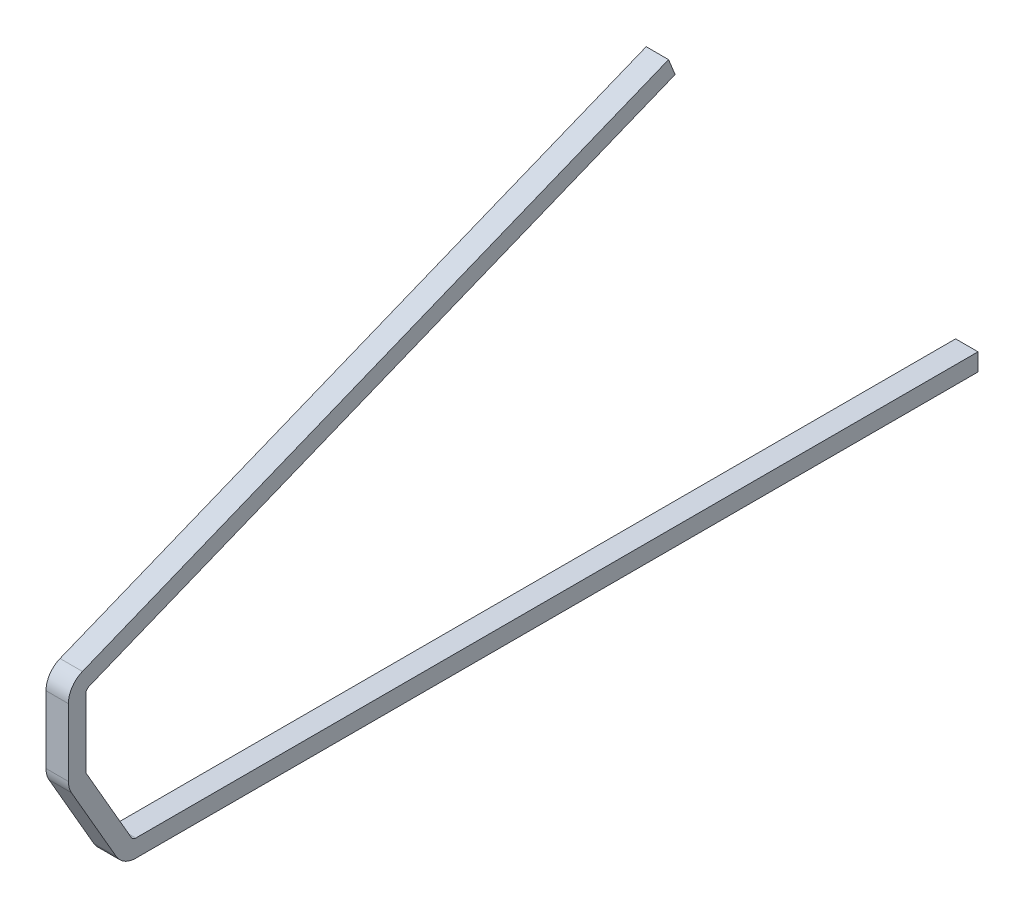
ISO-10303-21;
HEADER;
FILE_DESCRIPTION(('STEP AP214'),'2;1');
FILE_NAME('part.step','',(''),(''),'','','');
FILE_SCHEMA(('AUTOMOTIVE_DESIGN { 1 0 10303 214 1 1 1 1 }'));
ENDSEC;
DATA;
#1=APPLICATION_CONTEXT('core data for automotive mechanical design processes');
#2=APPLICATION_PROTOCOL_DEFINITION('international standard','automotive_design',2000,#1);
#3=PRODUCT_CONTEXT('',#1,'mechanical');
#4=PRODUCT('Part','Part','',(#3));
#5=PRODUCT_RELATED_PRODUCT_CATEGORY('part','',(#4));
#6=PRODUCT_DEFINITION_FORMATION('','',#4);
#7=PRODUCT_DEFINITION_CONTEXT('part definition',#1,'design');
#8=PRODUCT_DEFINITION('design','',#6,#7);
#9=PRODUCT_DEFINITION_SHAPE('','',#8);
#10=(LENGTH_UNIT() NAMED_UNIT(*) SI_UNIT(.MILLI.,.METRE.));
#11=(NAMED_UNIT(*) PLANE_ANGLE_UNIT() SI_UNIT($,.RADIAN.));
#12=(NAMED_UNIT(*) SI_UNIT($,.STERADIAN.) SOLID_ANGLE_UNIT());
#13=UNCERTAINTY_MEASURE_WITH_UNIT(LENGTH_MEASURE(1.E-05),#10,'distance_accuracy_value','');
#14=(GEOMETRIC_REPRESENTATION_CONTEXT(3) GLOBAL_UNCERTAINTY_ASSIGNED_CONTEXT((#13)) GLOBAL_UNIT_ASSIGNED_CONTEXT((#10,
#11,#12)) REPRESENTATION_CONTEXT('',''));
#15=CARTESIAN_POINT('',(0.,0.,0.));
#16=DIRECTION('',(0.,0.,1.));
#17=DIRECTION('',(1.,0.,0.));
#18=AXIS2_PLACEMENT_3D('',#15,#16,#17);
#19=CARTESIAN_POINT('',(0.,3.35260506818303,9.32259618943231));
#20=DIRECTION('',(-1.,0.,0.));
#21=DIRECTION('',(0.,0.,1.));
#22=AXIS2_PLACEMENT_3D('',#19,#20,#21);
#23=CYLINDRICAL_SURFACE('',#22,0.450000000000004);
#24=DIRECTION('',(1.,0.,0.));
#25=VECTOR('',#24,1.);
#26=CARTESIAN_POINT('',(0.,3.76983780273808,9.49116915646947));
#27=LINE('',#26,#25);
#28=CARTESIAN_POINT('',(-0.223999999999998,3.76983780273808,9.49116915646947));
#29=VERTEX_POINT('',#28);
#30=CARTESIAN_POINT('',(0.224,3.76983780273808,9.49116915646947));
#31=VERTEX_POINT('',#30);
#32=EDGE_CURVE('E36',#29,#31,#27,.T.);
#33=ORIENTED_EDGE('',*,*,#32,.F.);
#34=CARTESIAN_POINT('',(-0.223999999999998,3.35260506818303,9.32259618943231));
#35=DIRECTION('',(-1.,0.,0.));
#36=DIRECTION('',(0.,0.,1.));
#37=AXIS2_PLACEMENT_3D('',#34,#35,#36);
#38=CIRCLE('',#37,0.450000000000002);
#39=CARTESIAN_POINT('',(-0.223999999999998,3.35260506818303,9.77259618943231));
#40=VERTEX_POINT('',#39);
#41=EDGE_CURVE('E241',#40,#29,#38,.T.);
#42=ORIENTED_EDGE('',*,*,#41,.F.);
#43=DIRECTION('',(1.,0.,0.));
#44=VECTOR('',#43,1.);
#45=CARTESIAN_POINT('',(-0.223999999999998,3.35260506818303,9.77259618943231));
#46=LINE('',#45,#44);
#47=CARTESIAN_POINT('',(0.224,3.35260506818303,9.77259618943231));
#48=VERTEX_POINT('',#47);
#49=EDGE_CURVE('E11',#40,#48,#46,.T.);
#50=ORIENTED_EDGE('',*,*,#49,.T.);
#51=CARTESIAN_POINT('',(0.224,3.35260506818303,9.32259618943231));
#52=DIRECTION('',(1.,0.,0.));
#53=DIRECTION('',(0.,0.927183854566787,0.374606593415914));
#54=AXIS2_PLACEMENT_3D('',#51,#52,#53);
#55=CIRCLE('',#54,0.45);
#56=EDGE_CURVE('E234',#31,#48,#55,.T.);
#57=ORIENTED_EDGE('',*,*,#56,.F.);
#58=EDGE_LOOP('',(#33,#42,#50,#57));
#59=FACE_BOUND('',#58,.T.);
#60=ADVANCED_FACE('F17',(#59),#23,.T.);
#61=CARTESIAN_POINT('',(0.224,3.4453234536397,9.3600568487739));
#62=DIRECTION('',(1.,0.,0.));
#63=DIRECTION('',(0.,-0.927183854566786,-0.374606593415915));
#64=AXIS2_PLACEMENT_3D('',#61,#62,#63);
#65=PLANE('',#64);
#66=DIRECTION('',(0.,-0.374606593415914,0.927183854566787));
#67=VECTOR('',#66,1.);
#68=CARTESIAN_POINT('',(0.224,3.4709150269852,10.2310289889221));
#69=LINE('',#68,#67);
#70=CARTESIAN_POINT('',(0.224000000000003,8.50728928549821,-2.23443472720757));
#71=VERTEX_POINT('',#70);
#72=EDGE_CURVE('E249',#71,#31,#69,.T.);
#73=ORIENTED_EDGE('',*,*,#72,.T.);
#74=ORIENTED_EDGE('',*,*,#56,.T.);
#75=DIRECTION('',(0.,-1.,0.));
#76=VECTOR('',#75,1.);
#77=CARTESIAN_POINT('',(0.224,1.20671767076522,9.77259618943231));
#78=LINE('',#77,#76);
#79=CARTESIAN_POINT('',(0.224,2.00468220477703,9.77259618943231));
#80=VERTEX_POINT('',#79);
#81=EDGE_CURVE('E211',#48,#80,#78,.T.);
#82=ORIENTED_EDGE('',*,*,#81,.T.);
#83=CARTESIAN_POINT('',(0.224,2.00468220477703,9.32259618943231));
#84=DIRECTION('',(1.,0.,0.));
#85=DIRECTION('',(0.,0.,1.));
#86=AXIS2_PLACEMENT_3D('',#83,#84,#85);
#87=CIRCLE('',#86,0.449999999999997);
#88=CARTESIAN_POINT('',(0.224,1.77968220477703,9.71230762113531));
#89=VERTEX_POINT('',#88);
#90=EDGE_CURVE('E197',#80,#89,#87,.T.);
#91=ORIENTED_EDGE('',*,*,#90,.T.);
#92=DIRECTION('',(0.,-0.866025403784442,-0.499999999999995));
#93=VECTOR('',#92,1.);
#94=CARTESIAN_POINT('',(0.224,-0.46605755777324,8.41572916469708));
#95=LINE('',#94,#93);
#96=CARTESIAN_POINT('',(0.224,0.225000000000002,8.81471143170298));
#97=VERTEX_POINT('',#96);
#98=EDGE_CURVE('E182',#89,#97,#95,.T.);
#99=ORIENTED_EDGE('',*,*,#98,.T.);
#100=CARTESIAN_POINT('',(0.224,0.45,8.42499999999998));
#101=DIRECTION('',(1.,0.,0.));
#102=DIRECTION('',(0.,-0.499999999999995,0.866025403784442));
#103=AXIS2_PLACEMENT_3D('',#100,#101,#102);
#104=CIRCLE('',#103,0.450000000000001);
#105=CARTESIAN_POINT('',(0.224,0.,8.42499999999998));
#106=VERTEX_POINT('',#105);
#107=EDGE_CURVE('E152',#97,#106,#104,.T.);
#108=ORIENTED_EDGE('',*,*,#107,.T.);
#109=DIRECTION('',(0.,0.,-1.));
#110=VECTOR('',#109,1.);
#111=CARTESIAN_POINT('',(0.224,0.,8.42499999999998));
#112=LINE('',#111,#110);
#113=CARTESIAN_POINT('',(0.223999999999999,0.,-8.42500000000002));
#114=VERTEX_POINT('',#113);
#115=EDGE_CURVE('E21',#106,#114,#112,.T.);
#116=ORIENTED_EDGE('',*,*,#115,.T.);
#117=DIRECTION('',(0.,1.,0.));
#118=VECTOR('',#117,1.);
#119=CARTESIAN_POINT('',(0.223999999999999,0.,-8.42500000000002));
#120=LINE('',#119,#118);
#121=CARTESIAN_POINT('',(0.223999999999999,0.35,-8.42500000000002));
#122=VERTEX_POINT('',#121);
#123=EDGE_CURVE('E128',#114,#122,#120,.T.);
#124=ORIENTED_EDGE('',*,*,#123,.T.);
#125=DIRECTION('',(0.,0.,1.));
#126=VECTOR('',#125,1.);
#127=CARTESIAN_POINT('',(0.224,0.35,8.42499999999998));
#128=LINE('',#127,#126);
#129=CARTESIAN_POINT('',(0.224,0.35,8.42499999999998));
#130=VERTEX_POINT('',#129);
#131=EDGE_CURVE('E154',#122,#130,#128,.T.);
#132=ORIENTED_EDGE('',*,*,#131,.T.);
#133=CARTESIAN_POINT('',(0.224,0.45,8.42499999999998));
#134=DIRECTION('',(1.,0.,0.));
#135=DIRECTION('',(0.,-0.499999999999996,0.866025403784441));
#136=AXIS2_PLACEMENT_3D('',#133,#134,#135);
#137=CIRCLE('',#136,0.1);
#138=CARTESIAN_POINT('',(0.224,0.4,8.51160254037843));
#139=VERTEX_POINT('',#138);
#140=EDGE_CURVE('E165',#139,#130,#137,.T.);
#141=ORIENTED_EDGE('',*,*,#140,.F.);
#142=DIRECTION('',(0.,-0.866025403784442,-0.499999999999995));
#143=VECTOR('',#142,1.);
#144=CARTESIAN_POINT('',(0.224,-0.291057557773241,8.11262027337253));
#145=LINE('',#144,#143);
#146=CARTESIAN_POINT('',(0.224,1.95468220477703,9.40919872981075));
#147=VERTEX_POINT('',#146);
#148=EDGE_CURVE('E176',#147,#139,#145,.T.);
#149=ORIENTED_EDGE('',*,*,#148,.F.);
#150=CARTESIAN_POINT('',(0.224,2.00468220477703,9.32259618943231));
#151=DIRECTION('',(1.,0.,0.));
#152=DIRECTION('',(0.,0.,1.));
#153=AXIS2_PLACEMENT_3D('',#150,#151,#152);
#154=CIRCLE('',#153,0.099999999999999);
#155=CARTESIAN_POINT('',(0.224,2.00468220477703,9.42259618943231));
#156=VERTEX_POINT('',#155);
#157=EDGE_CURVE('E189',#156,#147,#154,.T.);
#158=ORIENTED_EDGE('',*,*,#157,.F.);
#159=DIRECTION('',(0.,-1.,0.));
#160=VECTOR('',#159,1.);
#161=CARTESIAN_POINT('',(0.224,1.20671767076522,9.42259618943231));
#162=LINE('',#161,#160);
#163=CARTESIAN_POINT('',(0.224,3.35260506818303,9.42259618943231));
#164=VERTEX_POINT('',#163);
#165=EDGE_CURVE('E205',#164,#156,#162,.T.);
#166=ORIENTED_EDGE('',*,*,#165,.F.);
#167=CARTESIAN_POINT('',(0.224,3.35260506818303,9.32259618943231));
#168=DIRECTION('',(1.,0.,0.));
#169=DIRECTION('',(0.,0.927183854566786,0.374606593415915));
#170=AXIS2_PLACEMENT_3D('',#167,#168,#169);
#171=CIRCLE('',#170,0.1);
#172=CARTESIAN_POINT('',(0.224,3.4453234536397,9.3600568487739));
#173=VERTEX_POINT('',#172);
#174=EDGE_CURVE('E220',#173,#164,#171,.T.);
#175=ORIENTED_EDGE('',*,*,#174,.F.);
#176=DIRECTION('',(0.,-0.374606593415914,0.927183854566787));
#177=VECTOR('',#176,1.);
#178=CARTESIAN_POINT('',(0.224,3.14640067788682,10.0999166812266));
#179=LINE('',#178,#177);
#180=CARTESIAN_POINT('',(0.224000000000003,8.18277493639983,-2.36554703490315));
#181=VERTEX_POINT('',#180);
#182=EDGE_CURVE('E240',#181,#173,#179,.T.);
#183=ORIENTED_EDGE('',*,*,#182,.F.);
#184=DIRECTION('',(0.,0.927183854566786,0.374606593415915));
#185=VECTOR('',#184,1.);
#186=CARTESIAN_POINT('',(0.224000000000003,8.18277493639983,-2.36554703490315));
#187=LINE('',#186,#185);
#188=EDGE_CURVE('E27',#181,#71,#187,.T.);
#189=ORIENTED_EDGE('',*,*,#188,.T.);
#190=EDGE_LOOP('',(#73,#74,#82,#91,#99,#108,#116,#124,#132,#141,#149,#158,#166,#175,#183,#189));
#191=FACE_BOUND('',#190,.T.);
#192=ADVANCED_FACE('F149',(#191),#65,.T.);
#193=CARTESIAN_POINT('',(0.,5.75758600404423,3.63700620862088));
#194=DIRECTION('',(0.,0.927183854566787,0.374606593415914));
#195=DIRECTION('',(1.,0.,0.));
#196=AXIS2_PLACEMENT_3D('',#193,#194,#195);
#197=PLANE('',#196);
#198=DIRECTION('',(-1.,0.,0.));
#199=VECTOR('',#198,1.);
#200=CARTESIAN_POINT('',(0.,3.44532345363971,9.3600568487739));
#201=LINE('',#200,#199);
#202=CARTESIAN_POINT('',(-0.223999999999998,3.4453234536397,9.3600568487739));
#203=VERTEX_POINT('',#202);
#204=EDGE_CURVE('E245',#173,#203,#201,.T.);
#205=ORIENTED_EDGE('',*,*,#204,.T.);
#206=DIRECTION('',(0.,-0.374606593415914,0.927183854566787));
#207=VECTOR('',#206,1.);
#208=CARTESIAN_POINT('',(-0.223999999999998,3.14640067788682,10.0999166812266));
#209=LINE('',#208,#207);
#210=CARTESIAN_POINT('',(-0.223999999999995,8.18277493639983,-2.36554703490315));
#211=VERTEX_POINT('',#210);
#212=EDGE_CURVE('E228',#211,#203,#209,.T.);
#213=ORIENTED_EDGE('',*,*,#212,.F.);
#214=DIRECTION('',(1.,0.,0.));
#215=VECTOR('',#214,1.);
#216=CARTESIAN_POINT('',(-0.223999999999995,8.18277493639983,-2.36554703490315));
#217=LINE('',#216,#215);
#218=EDGE_CURVE('E242',#211,#181,#217,.T.);
#219=ORIENTED_EDGE('',*,*,#218,.T.);
#220=ORIENTED_EDGE('',*,*,#182,.T.);
#221=EDGE_LOOP('',(#205,#213,#219,#220));
#222=FACE_BOUND('',#221,.T.);
#223=ADVANCED_FACE('F307',(#222),#197,.F.);
#224=CARTESIAN_POINT('',(-0.223999999999998,3.4453234536397,9.3600568487739));
#225=DIRECTION('',(-1.,0.,0.));
#226=DIRECTION('',(0.,0.,1.));
#227=AXIS2_PLACEMENT_3D('',#224,#225,#226);
#228=PLANE('',#227);
#229=ORIENTED_EDGE('',*,*,#41,.T.);
#230=DIRECTION('',(0.,0.374606593415914,-0.927183854566787));
#231=VECTOR('',#230,1.);
#232=CARTESIAN_POINT('',(-0.223999999999998,3.76983780273808,9.49116915646947));
#233=LINE('',#232,#231);
#234=CARTESIAN_POINT('',(-0.223999999999995,8.50728928549821,-2.23443472720757));
#235=VERTEX_POINT('',#234);
#236=EDGE_CURVE('E231',#29,#235,#233,.T.);
#237=ORIENTED_EDGE('',*,*,#236,.T.);
#238=DIRECTION('',(0.,0.927183854566786,0.374606593415915));
#239=VECTOR('',#238,1.);
#240=CARTESIAN_POINT('',(-0.223999999999995,8.18277493639983,-2.36554703490315));
#241=LINE('',#240,#239);
#242=EDGE_CURVE('E229',#211,#235,#241,.T.);
#243=ORIENTED_EDGE('',*,*,#242,.F.);
#244=ORIENTED_EDGE('',*,*,#212,.T.);
#245=CARTESIAN_POINT('',(-0.223999999999998,3.35260506818303,9.32259618943231));
#246=DIRECTION('',(1.,0.,0.));
#247=DIRECTION('',(0.,0.927183854566786,0.374606593415915));
#248=AXIS2_PLACEMENT_3D('',#245,#246,#247);
#249=CIRCLE('',#248,0.1);
#250=CARTESIAN_POINT('',(-0.223999999999998,3.35260506818303,9.42259618943231));
#251=VERTEX_POINT('',#250);
#252=EDGE_CURVE('E237',#203,#251,#249,.T.);
#253=ORIENTED_EDGE('',*,*,#252,.T.);
#254=DIRECTION('',(0.,-1.,0.));
#255=VECTOR('',#254,1.);
#256=CARTESIAN_POINT('',(-0.223999999999998,1.20671767076522,9.42259618943231));
#257=LINE('',#256,#255);
#258=CARTESIAN_POINT('',(-0.223999999999998,2.00468220477703,9.42259618943231));
#259=VERTEX_POINT('',#258);
#260=EDGE_CURVE('E198',#251,#259,#257,.T.);
#261=ORIENTED_EDGE('',*,*,#260,.T.);
#262=CARTESIAN_POINT('',(-0.223999999999998,2.00468220477703,9.32259618943231));
#263=DIRECTION('',(1.,0.,0.));
#264=DIRECTION('',(0.,0.,1.));
#265=AXIS2_PLACEMENT_3D('',#262,#263,#264);
#266=CIRCLE('',#265,0.099999999999999);
#267=CARTESIAN_POINT('',(-0.223999999999998,1.95468220477703,9.40919872981075));
#268=VERTEX_POINT('',#267);
#269=EDGE_CURVE('E202',#259,#268,#266,.T.);
#270=ORIENTED_EDGE('',*,*,#269,.T.);
#271=DIRECTION('',(0.,-0.866025403784442,-0.499999999999995));
#272=VECTOR('',#271,1.);
#273=CARTESIAN_POINT('',(-0.223999999999998,-0.291057557773241,8.11262027337253));
#274=LINE('',#273,#272);
#275=CARTESIAN_POINT('',(-0.223999999999998,0.4,8.51160254037843));
#276=VERTEX_POINT('',#275);
#277=EDGE_CURVE('E169',#268,#276,#274,.T.);
#278=ORIENTED_EDGE('',*,*,#277,.T.);
#279=CARTESIAN_POINT('',(-0.223999999999998,0.45,8.42499999999998));
#280=DIRECTION('',(1.,0.,0.));
#281=DIRECTION('',(0.,-0.499999999999996,0.866025403784441));
#282=AXIS2_PLACEMENT_3D('',#279,#280,#281);
#283=CIRCLE('',#282,0.1);
#284=CARTESIAN_POINT('',(-0.223999999999998,0.35,8.42499999999998));
#285=VERTEX_POINT('',#284);
#286=EDGE_CURVE('E173',#276,#285,#283,.T.);
#287=ORIENTED_EDGE('',*,*,#286,.T.);
#288=DIRECTION('',(0.,0.,-1.));
#289=VECTOR('',#288,1.);
#290=CARTESIAN_POINT('',(-0.224000000000001,0.35,-8.42500000000002));
#291=LINE('',#290,#289);
#292=CARTESIAN_POINT('',(-0.224000000000001,0.35,-8.42500000000002));
#293=VERTEX_POINT('',#292);
#294=EDGE_CURVE('E159',#285,#293,#291,.T.);
#295=ORIENTED_EDGE('',*,*,#294,.T.);
#296=DIRECTION('',(0.,1.,0.));
#297=VECTOR('',#296,1.);
#298=CARTESIAN_POINT('',(-0.224000000000001,0.,-8.42500000000002));
#299=LINE('',#298,#297);
#300=CARTESIAN_POINT('',(-0.224000000000001,0.,-8.42500000000002));
#301=VERTEX_POINT('',#300);
#302=EDGE_CURVE('E146',#301,#293,#299,.T.);
#303=ORIENTED_EDGE('',*,*,#302,.F.);
#304=DIRECTION('',(0.,0.,1.));
#305=VECTOR('',#304,1.);
#306=CARTESIAN_POINT('',(-0.224000000000001,0.,-8.42500000000002));
#307=LINE('',#306,#305);
#308=CARTESIAN_POINT('',(-0.223999999999998,0.,8.42499999999998));
#309=VERTEX_POINT('',#308);
#310=EDGE_CURVE('E145',#301,#309,#307,.T.);
#311=ORIENTED_EDGE('',*,*,#310,.T.);
#312=CARTESIAN_POINT('',(-0.223999999999998,0.45,8.42499999999998));
#313=DIRECTION('',(-1.,0.,0.));
#314=DIRECTION('',(0.,-1.,0.));
#315=AXIS2_PLACEMENT_3D('',#312,#313,#314);
#316=CIRCLE('',#315,0.45);
#317=CARTESIAN_POINT('',(-0.223999999999998,0.225000000000002,8.81471143170298));
#318=VERTEX_POINT('',#317);
#319=EDGE_CURVE('E177',#309,#318,#316,.T.);
#320=ORIENTED_EDGE('',*,*,#319,.T.);
#321=DIRECTION('',(0.,0.866025403784442,0.499999999999995));
#322=VECTOR('',#321,1.);
#323=CARTESIAN_POINT('',(-0.223999999999998,0.225000000000002,8.81471143170298));
#324=LINE('',#323,#322);
#325=CARTESIAN_POINT('',(-0.223999999999998,1.77968220477703,9.71230762113531));
#326=VERTEX_POINT('',#325);
#327=EDGE_CURVE('E166',#318,#326,#324,.T.);
#328=ORIENTED_EDGE('',*,*,#327,.T.);
#329=CARTESIAN_POINT('',(-0.223999999999998,2.00468220477703,9.32259618943231));
#330=DIRECTION('',(-1.,0.,0.));
#331=DIRECTION('',(0.,-0.499999999999985,0.866025403784447));
#332=AXIS2_PLACEMENT_3D('',#329,#330,#331);
#333=CIRCLE('',#332,0.450000000000002);
#334=CARTESIAN_POINT('',(-0.223999999999998,2.00468220477703,9.77259618943231));
#335=VERTEX_POINT('',#334);
#336=EDGE_CURVE('E206',#326,#335,#333,.T.);
#337=ORIENTED_EDGE('',*,*,#336,.T.);
#338=DIRECTION('',(0.,1.,0.));
#339=VECTOR('',#338,1.);
#340=CARTESIAN_POINT('',(-0.223999999999998,2.00468220477703,9.77259618943231));
#341=LINE('',#340,#339);
#342=EDGE_CURVE('E194',#335,#40,#341,.T.);
#343=ORIENTED_EDGE('',*,*,#342,.T.);
#344=EDGE_LOOP('',(#229,#237,#243,#244,#253,#261,#270,#278,#287,#295,#303,#311,#320,#328,#337,#343));
#345=FACE_BOUND('',#344,.T.);
#346=ADVANCED_FACE('F269',(#345),#228,.T.);
#347=CARTESIAN_POINT('',(-0.223999999999995,8.18277493639983,-2.36554703490315));
#348=DIRECTION('',(0.,0.374606593415915,-0.927183854566786));
#349=DIRECTION('',(0.,0.927183854566786,0.374606593415915));
#350=AXIS2_PLACEMENT_3D('',#347,#348,#349);
#351=PLANE('',#350);
#352=DIRECTION('',(1.,0.,0.));
#353=VECTOR('',#352,1.);
#354=CARTESIAN_POINT('',(-0.223999999999995,8.5072892854982,-2.23443472720758));
#355=LINE('',#354,#353);
#356=EDGE_CURVE('E225',#235,#71,#355,.T.);
#357=ORIENTED_EDGE('',*,*,#356,.T.);
#358=ORIENTED_EDGE('',*,*,#188,.F.);
#359=ORIENTED_EDGE('',*,*,#218,.F.);
#360=ORIENTED_EDGE('',*,*,#242,.T.);
#361=EDGE_LOOP('',(#357,#358,#359,#360));
#362=FACE_BOUND('',#361,.T.);
#363=ADVANCED_FACE('F266',(#362),#351,.T.);
#364=CARTESIAN_POINT('',(0.,6.0821003531426,3.76811851631645));
#365=DIRECTION('',(0.,0.927183854566787,0.374606593415914));
#366=DIRECTION('',(1.,0.,0.));
#367=AXIS2_PLACEMENT_3D('',#364,#365,#366);
#368=PLANE('',#367);
#369=ORIENTED_EDGE('',*,*,#32,.T.);
#370=ORIENTED_EDGE('',*,*,#72,.F.);
#371=ORIENTED_EDGE('',*,*,#356,.F.);
#372=ORIENTED_EDGE('',*,*,#236,.F.);
#373=EDGE_LOOP('',(#369,#370,#371,#372));
#374=FACE_BOUND('',#373,.T.);
#375=ADVANCED_FACE('F258',(#374),#368,.T.);
#376=CARTESIAN_POINT('',(0.,3.35260506818303,9.32259618943231));
#377=DIRECTION('',(-1.,0.,0.));
#378=DIRECTION('',(0.,0.,1.));
#379=AXIS2_PLACEMENT_3D('',#376,#377,#378);
#380=CYLINDRICAL_SURFACE('',#379,0.100000000000004);
#381=ORIENTED_EDGE('',*,*,#204,.F.);
#382=ORIENTED_EDGE('',*,*,#174,.T.);
#383=DIRECTION('',(1.,0.,0.));
#384=VECTOR('',#383,1.);
#385=CARTESIAN_POINT('',(-0.223999999999998,3.35260506818303,9.42259618943231));
#386=LINE('',#385,#384);
#387=EDGE_CURVE('E212',#251,#164,#386,.T.);
#388=ORIENTED_EDGE('',*,*,#387,.F.);
#389=ORIENTED_EDGE('',*,*,#252,.F.);
#390=EDGE_LOOP('',(#381,#382,#388,#389));
#391=FACE_BOUND('',#390,.T.);
#392=ADVANCED_FACE('F304',(#391),#380,.F.);
#393=CARTESIAN_POINT('',(0.,2.00468220477703,9.32259618943231));
#394=DIRECTION('',(-1.,0.,0.));
#395=DIRECTION('',(0.,-0.499999999999994,0.866025403784442));
#396=AXIS2_PLACEMENT_3D('',#393,#394,#395);
#397=CYLINDRICAL_SURFACE('',#396,0.450000000000003);
#398=DIRECTION('',(1.,0.,0.));
#399=VECTOR('',#398,1.);
#400=CARTESIAN_POINT('',(0.,2.00468220477703,9.77259618943231));
#401=LINE('',#400,#399);
#402=EDGE_CURVE('E201',#335,#80,#401,.T.);
#403=ORIENTED_EDGE('',*,*,#402,.F.);
#404=ORIENTED_EDGE('',*,*,#336,.F.);
#405=DIRECTION('',(1.,0.,0.));
#406=VECTOR('',#405,1.);
#407=CARTESIAN_POINT('',(-0.223999999999998,1.77968220477703,9.71230762113531));
#408=LINE('',#407,#406);
#409=EDGE_CURVE('E215',#326,#89,#408,.T.);
#410=ORIENTED_EDGE('',*,*,#409,.T.);
#411=ORIENTED_EDGE('',*,*,#90,.F.);
#412=EDGE_LOOP('',(#403,#404,#410,#411));
#413=FACE_BOUND('',#412,.T.);
#414=ADVANCED_FACE('F277',(#413),#397,.T.);
#415=CARTESIAN_POINT('',(0.,2.61214659197904,9.42259618943231));
#416=DIRECTION('',(0.,0.,1.));
#417=DIRECTION('',(1.,0.,0.));
#418=AXIS2_PLACEMENT_3D('',#415,#416,#417);
#419=PLANE('',#418);
#420=DIRECTION('',(-1.,0.,0.));
#421=VECTOR('',#420,1.);
#422=CARTESIAN_POINT('',(0.,2.00468220477703,9.42259618943231));
#423=LINE('',#422,#421);
#424=EDGE_CURVE('E208',#156,#259,#423,.T.);
#425=ORIENTED_EDGE('',*,*,#424,.T.);
#426=ORIENTED_EDGE('',*,*,#260,.F.);
#427=ORIENTED_EDGE('',*,*,#387,.T.);
#428=ORIENTED_EDGE('',*,*,#165,.T.);
#429=EDGE_LOOP('',(#425,#426,#427,#428));
#430=FACE_BOUND('',#429,.T.);
#431=ADVANCED_FACE('F301',(#430),#419,.F.);
#432=CARTESIAN_POINT('',(0.,2.61214659197904,9.77259618943231));
#433=DIRECTION('',(0.,0.,1.));
#434=DIRECTION('',(1.,0.,0.));
#435=AXIS2_PLACEMENT_3D('',#432,#433,#434);
#436=PLANE('',#435);
#437=ORIENTED_EDGE('',*,*,#402,.T.);
#438=ORIENTED_EDGE('',*,*,#81,.F.);
#439=ORIENTED_EDGE('',*,*,#49,.F.);
#440=ORIENTED_EDGE('',*,*,#342,.F.);
#441=EDGE_LOOP('',(#437,#438,#439,#440));
#442=FACE_BOUND('',#441,.T.);
#443=ADVANCED_FACE('F272',(#442),#436,.T.);
#444=CARTESIAN_POINT('',(0.,2.00468220477703,9.32259618943231));
#445=DIRECTION('',(-1.,0.,0.));
#446=DIRECTION('',(0.,-0.499999999999995,0.866025403784442));
#447=AXIS2_PLACEMENT_3D('',#444,#445,#446);
#448=CYLINDRICAL_SURFACE('',#447,0.100000000000003);
#449=ORIENTED_EDGE('',*,*,#424,.F.);
#450=ORIENTED_EDGE('',*,*,#157,.T.);
#451=DIRECTION('',(1.,0.,0.));
#452=VECTOR('',#451,1.);
#453=CARTESIAN_POINT('',(-0.223999999999998,1.95468220477703,9.40919872981075));
#454=LINE('',#453,#452);
#455=EDGE_CURVE('E183',#268,#147,#454,.T.);
#456=ORIENTED_EDGE('',*,*,#455,.F.);
#457=ORIENTED_EDGE('',*,*,#269,.F.);
#458=EDGE_LOOP('',(#449,#450,#456,#457));
#459=FACE_BOUND('',#458,.T.);
#460=ADVANCED_FACE('F298',(#459),#448,.F.);
#461=CARTESIAN_POINT('',(0.,0.45,8.42499999999998));
#462=DIRECTION('',(-1.,0.,0.));
#463=DIRECTION('',(0.,-1.,0.));
#464=AXIS2_PLACEMENT_3D('',#461,#462,#463);
#465=CYLINDRICAL_SURFACE('',#464,0.45);
#466=DIRECTION('',(1.,0.,0.));
#467=VECTOR('',#466,1.);
#468=CARTESIAN_POINT('',(0.,0.225000000000001,8.81471143170298));
#469=LINE('',#468,#467);
#470=EDGE_CURVE('E172',#318,#97,#469,.T.);
#471=ORIENTED_EDGE('',*,*,#470,.F.);
#472=ORIENTED_EDGE('',*,*,#319,.F.);
#473=DIRECTION('',(1.,0.,0.));
#474=VECTOR('',#473,1.);
#475=CARTESIAN_POINT('',(-0.223999999999998,0.,8.42499999999998));
#476=LINE('',#475,#474);
#477=EDGE_CURVE('E185',#309,#106,#476,.T.);
#478=ORIENTED_EDGE('',*,*,#477,.T.);
#479=ORIENTED_EDGE('',*,*,#107,.F.);
#480=EDGE_LOOP('',(#471,#472,#478,#479));
#481=FACE_BOUND('',#480,.T.);
#482=ADVANCED_FACE('F282',(#481),#465,.T.);
#483=CARTESIAN_POINT('',(0.,1.06216484275964,8.89390359059361));
#484=DIRECTION('',(0.,0.499999999999995,-0.866025403784442));
#485=DIRECTION('',(0.,0.866025403784442,0.499999999999995));
#486=AXIS2_PLACEMENT_3D('',#483,#484,#485);
#487=PLANE('',#486);
#488=DIRECTION('',(-1.,0.,0.));
#489=VECTOR('',#488,1.);
#490=CARTESIAN_POINT('',(0.,0.399999999999999,8.51160254037843));
#491=LINE('',#490,#489);
#492=EDGE_CURVE('E179',#139,#276,#491,.T.);
#493=ORIENTED_EDGE('',*,*,#492,.T.);
#494=ORIENTED_EDGE('',*,*,#277,.F.);
#495=ORIENTED_EDGE('',*,*,#455,.T.);
#496=ORIENTED_EDGE('',*,*,#148,.T.);
#497=EDGE_LOOP('',(#493,#494,#495,#496));
#498=FACE_BOUND('',#497,.T.);
#499=ADVANCED_FACE('F293',(#498),#487,.T.);
#500=CARTESIAN_POINT('',(0.,0.887164842759646,9.19701248191816));
#501=DIRECTION('',(0.,0.499999999999995,-0.866025403784442));
#502=DIRECTION('',(0.,0.866025403784442,0.499999999999995));
#503=AXIS2_PLACEMENT_3D('',#500,#501,#502);
#504=PLANE('',#503);
#505=ORIENTED_EDGE('',*,*,#470,.T.);
#506=ORIENTED_EDGE('',*,*,#98,.F.);
#507=ORIENTED_EDGE('',*,*,#409,.F.);
#508=ORIENTED_EDGE('',*,*,#327,.F.);
#509=EDGE_LOOP('',(#505,#506,#507,#508));
#510=FACE_BOUND('',#509,.T.);
#511=ADVANCED_FACE('F280',(#510),#504,.F.);
#512=CARTESIAN_POINT('',(0.,0.45,8.42499999999998));
#513=DIRECTION('',(-1.,0.,0.));
#514=DIRECTION('',(0.,-1.,0.));
#515=AXIS2_PLACEMENT_3D('',#512,#513,#514);
#516=CYLINDRICAL_SURFACE('',#515,0.0999999999999998);
#517=ORIENTED_EDGE('',*,*,#492,.F.);
#518=ORIENTED_EDGE('',*,*,#140,.T.);
#519=DIRECTION('',(-1.,0.,0.));
#520=VECTOR('',#519,1.);
#521=CARTESIAN_POINT('',(-0.223999999999998,0.35,8.42499999999998));
#522=LINE('',#521,#520);
#523=EDGE_CURVE('E163',#130,#285,#522,.T.);
#524=ORIENTED_EDGE('',*,*,#523,.T.);
#525=ORIENTED_EDGE('',*,*,#286,.F.);
#526=EDGE_LOOP('',(#517,#518,#524,#525));
#527=FACE_BOUND('',#526,.T.);
#528=ADVANCED_FACE('F288',(#527),#516,.F.);
#529=CARTESIAN_POINT('',(-0.224000000000001,0.,-8.42500000000002));
#530=DIRECTION('',(0.,0.,-1.));
#531=DIRECTION('',(-1.,0.,0.));
#532=AXIS2_PLACEMENT_3D('',#529,#530,#531);
#533=PLANE('',#532);
#534=DIRECTION('',(1.,0.,0.));
#535=VECTOR('',#534,1.);
#536=CARTESIAN_POINT('',(0.223999999999999,0.35,-8.42500000000002));
#537=LINE('',#536,#535);
#538=EDGE_CURVE('E136',#293,#122,#537,.T.);
#539=ORIENTED_EDGE('',*,*,#538,.T.);
#540=ORIENTED_EDGE('',*,*,#123,.F.);
#541=DIRECTION('',(-1.,0.,0.));
#542=VECTOR('',#541,1.);
#543=CARTESIAN_POINT('',(0.223999999999999,0.,-8.42500000000002));
#544=LINE('',#543,#542);
#545=EDGE_CURVE('E134',#114,#301,#544,.T.);
#546=ORIENTED_EDGE('',*,*,#545,.T.);
#547=ORIENTED_EDGE('',*,*,#302,.T.);
#548=EDGE_LOOP('',(#539,#540,#546,#547));
#549=FACE_BOUND('',#548,.T.);
#550=ADVANCED_FACE('F133',(#549),#533,.T.);
#551=CARTESIAN_POINT('',(0.,0.,0.));
#552=DIRECTION('',(0.,1.,0.));
#553=DIRECTION('',(0.,0.,1.));
#554=AXIS2_PLACEMENT_3D('',#551,#552,#553);
#555=PLANE('',#554);
#556=ORIENTED_EDGE('',*,*,#477,.F.);
#557=ORIENTED_EDGE('',*,*,#310,.F.);
#558=ORIENTED_EDGE('',*,*,#545,.F.);
#559=ORIENTED_EDGE('',*,*,#115,.F.);
#560=EDGE_LOOP('',(#556,#557,#558,#559));
#561=FACE_BOUND('',#560,.T.);
#562=ADVANCED_FACE('F143',(#561),#555,.F.);
#563=CARTESIAN_POINT('',(0.,0.35,0.));
#564=DIRECTION('',(0.,1.,0.));
#565=DIRECTION('',(0.,0.,1.));
#566=AXIS2_PLACEMENT_3D('',#563,#564,#565);
#567=PLANE('',#566);
#568=ORIENTED_EDGE('',*,*,#294,.F.);
#569=ORIENTED_EDGE('',*,*,#523,.F.);
#570=ORIENTED_EDGE('',*,*,#131,.F.);
#571=ORIENTED_EDGE('',*,*,#538,.F.);
#572=EDGE_LOOP('',(#568,#569,#570,#571));
#573=FACE_BOUND('',#572,.T.);
#574=ADVANCED_FACE('F19',(#573),#567,.T.);
#575=CLOSED_SHELL('',(#60,#192,#223,#346,#363,#375,#392,#414,#431,#443,#460,#482,#499,#511,#528,
#550,#562,#574));
#576=MANIFOLD_SOLID_BREP('B1',#575);
#577=ADVANCED_BREP_SHAPE_REPRESENTATION('',(#18,#576),#14);
#578=SHAPE_DEFINITION_REPRESENTATION(#9,#577);
ENDSEC;
END-ISO-10303-21;
